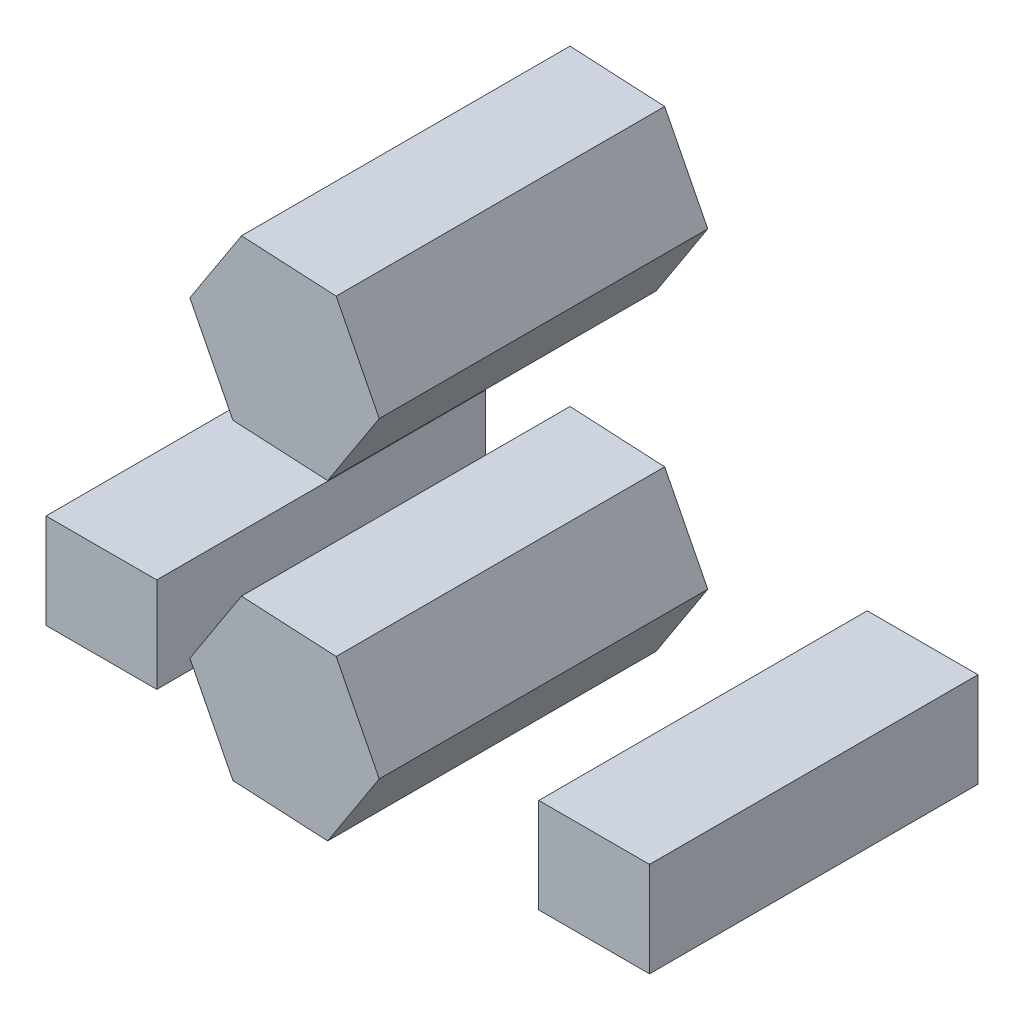
ISO-10303-21;
HEADER;
FILE_DESCRIPTION(('STEP AP214'),'2;1');
FILE_NAME('part.step','',(''),(''),'','','');
FILE_SCHEMA(('AUTOMOTIVE_DESIGN { 1 0 10303 214 1 1 1 1 }'));
ENDSEC;
DATA;
#1=APPLICATION_CONTEXT('core data for automotive mechanical design processes');
#2=APPLICATION_PROTOCOL_DEFINITION('international standard','automotive_design',2000,#1);
#3=PRODUCT_CONTEXT('',#1,'mechanical');
#4=PRODUCT('Part','Part','',(#3));
#5=PRODUCT_RELATED_PRODUCT_CATEGORY('part','',(#4));
#6=PRODUCT_DEFINITION_FORMATION('','',#4);
#7=PRODUCT_DEFINITION_CONTEXT('part definition',#1,'design');
#8=PRODUCT_DEFINITION('design','',#6,#7);
#9=PRODUCT_DEFINITION_SHAPE('','',#8);
#10=(LENGTH_UNIT() NAMED_UNIT(*) SI_UNIT(.MILLI.,.METRE.));
#11=(NAMED_UNIT(*) PLANE_ANGLE_UNIT() SI_UNIT($,.RADIAN.));
#12=(NAMED_UNIT(*) SI_UNIT($,.STERADIAN.) SOLID_ANGLE_UNIT());
#13=UNCERTAINTY_MEASURE_WITH_UNIT(LENGTH_MEASURE(1.E-05),#10,'distance_accuracy_value','');
#14=(GEOMETRIC_REPRESENTATION_CONTEXT(3) GLOBAL_UNCERTAINTY_ASSIGNED_CONTEXT((#13)) GLOBAL_UNIT_ASSIGNED_CONTEXT((#10,
#11,#12)) REPRESENTATION_CONTEXT('',''));
#15=CARTESIAN_POINT('',(0.,0.,0.));
#16=DIRECTION('',(0.,0.,1.));
#17=DIRECTION('',(1.,0.,0.));
#18=AXIS2_PLACEMENT_3D('',#15,#16,#17);
#19=CARTESIAN_POINT('',(26.2277971585116,138.566197986681,200.));
#20=DIRECTION('',(-0.838846748945208,0.544367643954025,0.));
#21=DIRECTION('',(-0.544367643954025,-0.838846748945208,0.));
#22=AXIS2_PLACEMENT_3D('',#19,#20,#21);
#23=PLANE('',#22);
#24=DIRECTION('',(0.544367643954025,0.838846748945208,0.));
#25=VECTOR('',#24,1.);
#26=CARTESIAN_POINT('',(26.2277971585116,138.566197986681,0.));
#27=LINE('',#26,#25);
#28=CARTESIAN_POINT('',(26.2277971585116,138.566197986681,0.));
#29=VERTEX_POINT('',#28);
#30=CARTESIAN_POINT('',(57.6568777360095,186.997037617917,0.));
#31=VERTEX_POINT('',#30);
#32=EDGE_CURVE('E132',#29,#31,#27,.T.);
#33=ORIENTED_EDGE('',*,*,#32,.T.);
#34=DIRECTION('',(0.,0.,-1.));
#35=VECTOR('',#34,1.);
#36=CARTESIAN_POINT('',(57.6568777360095,186.997037617917,200.));
#37=LINE('',#36,#35);
#38=CARTESIAN_POINT('',(57.6568777360095,186.997037617917,200.));
#39=VERTEX_POINT('',#38);
#40=EDGE_CURVE('E12',#39,#31,#37,.T.);
#41=ORIENTED_EDGE('',*,*,#40,.F.);
#42=DIRECTION('',(0.544367643954025,0.838846748945208,0.));
#43=VECTOR('',#42,1.);
#44=CARTESIAN_POINT('',(26.2277971585116,138.566197986681,200.));
#45=LINE('',#44,#43);
#46=CARTESIAN_POINT('',(26.2277971585116,138.566197986681,200.));
#47=VERTEX_POINT('',#46);
#48=EDGE_CURVE('E142',#47,#39,#45,.T.);
#49=ORIENTED_EDGE('',*,*,#48,.F.);
#50=DIRECTION('',(0.,0.,-1.));
#51=VECTOR('',#50,1.);
#52=CARTESIAN_POINT('',(26.2277971585116,138.566197986681,200.));
#53=LINE('',#52,#51);
#54=EDGE_CURVE('E128',#47,#29,#53,.T.);
#55=ORIENTED_EDGE('',*,*,#54,.T.);
#56=EDGE_LOOP('',(#33,#41,#49,#55));
#57=FACE_BOUND('',#56,.T.);
#58=ADVANCED_FACE('F48',(#57),#23,.F.);
#59=CARTESIAN_POINT('',(57.6568777360095,186.997037617917,200.));
#60=DIRECTION('',(-0.890859583135072,-0.454278772491525,0.));
#61=DIRECTION('',(0.454278772491525,-0.890859583135072,0.));
#62=AXIS2_PLACEMENT_3D('',#59,#60,#61);
#63=PLANE('',#62);
#64=DIRECTION('',(-0.454278772491525,0.890859583135072,0.));
#65=VECTOR('',#64,1.);
#66=CARTESIAN_POINT('',(57.6568777360095,186.997037617917,0.));
#67=LINE('',#66,#65);
#68=CARTESIAN_POINT('',(31.429080577498,238.430839631236,0.));
#69=VERTEX_POINT('',#68);
#70=EDGE_CURVE('E135',#31,#69,#67,.T.);
#71=ORIENTED_EDGE('',*,*,#70,.T.);
#72=DIRECTION('',(0.,0.,-1.));
#73=VECTOR('',#72,1.);
#74=CARTESIAN_POINT('',(31.429080577498,238.430839631236,200.));
#75=LINE('',#74,#73);
#76=CARTESIAN_POINT('',(31.429080577498,238.430839631236,200.));
#77=VERTEX_POINT('',#76);
#78=EDGE_CURVE('E56',#77,#69,#75,.T.);
#79=ORIENTED_EDGE('',*,*,#78,.F.);
#80=DIRECTION('',(-0.454278772491525,0.890859583135072,0.));
#81=VECTOR('',#80,1.);
#82=CARTESIAN_POINT('',(57.6568777360095,186.997037617917,200.));
#83=LINE('',#82,#81);
#84=EDGE_CURVE('E101',#39,#77,#83,.T.);
#85=ORIENTED_EDGE('',*,*,#84,.F.);
#86=ORIENTED_EDGE('',*,*,#40,.T.);
#87=EDGE_LOOP('',(#71,#79,#85,#86));
#88=FACE_BOUND('',#87,.T.);
#89=ADVANCED_FACE('F166',(#88),#63,.F.);
#90=CARTESIAN_POINT('',(31.429080577498,238.430839631236,200.));
#91=DIRECTION('',(-0.0520128341898639,-0.998646416445549,0.));
#92=DIRECTION('',(0.998646416445549,-0.0520128341898639,0.));
#93=AXIS2_PLACEMENT_3D('',#90,#91,#92);
#94=PLANE('',#93);
#95=DIRECTION('',(-0.998646416445549,0.0520128341898639,0.));
#96=VECTOR('',#95,1.);
#97=CARTESIAN_POINT('',(31.429080577498,238.430839631236,0.));
#98=LINE('',#97,#96);
#99=CARTESIAN_POINT('',(-26.2277971585116,241.433802013319,0.));
#100=VERTEX_POINT('',#99);
#101=EDGE_CURVE('E137',#69,#100,#98,.T.);
#102=ORIENTED_EDGE('',*,*,#101,.T.);
#103=DIRECTION('',(0.,0.,-1.));
#104=VECTOR('',#103,1.);
#105=CARTESIAN_POINT('',(-26.2277971585116,241.433802013319,200.));
#106=LINE('',#105,#104);
#107=CARTESIAN_POINT('',(-26.2277971585116,241.433802013319,200.));
#108=VERTEX_POINT('',#107);
#109=EDGE_CURVE('E123',#108,#100,#106,.T.);
#110=ORIENTED_EDGE('',*,*,#109,.F.);
#111=DIRECTION('',(-0.998646416445549,0.0520128341898639,0.));
#112=VECTOR('',#111,1.);
#113=CARTESIAN_POINT('',(31.429080577498,238.430839631236,200.));
#114=LINE('',#113,#112);
#115=EDGE_CURVE('E114',#77,#108,#114,.T.);
#116=ORIENTED_EDGE('',*,*,#115,.F.);
#117=ORIENTED_EDGE('',*,*,#78,.T.);
#118=EDGE_LOOP('',(#102,#110,#116,#117));
#119=FACE_BOUND('',#118,.T.);
#120=ADVANCED_FACE('F148',(#119),#94,.F.);
#121=CARTESIAN_POINT('',(-26.2277971585116,241.433802013319,200.));
#122=DIRECTION('',(0.838846748945208,-0.544367643954025,0.));
#123=DIRECTION('',(0.544367643954025,0.838846748945208,0.));
#124=AXIS2_PLACEMENT_3D('',#121,#122,#123);
#125=PLANE('',#124);
#126=DIRECTION('',(-0.544367643954025,-0.838846748945208,0.));
#127=VECTOR('',#126,1.);
#128=CARTESIAN_POINT('',(-26.2277971585116,241.433802013319,0.));
#129=LINE('',#128,#127);
#130=CARTESIAN_POINT('',(-57.6568777360095,193.002962382083,0.));
#131=VERTEX_POINT('',#130);
#132=EDGE_CURVE('E122',#100,#131,#129,.T.);
#133=ORIENTED_EDGE('',*,*,#132,.T.);
#134=DIRECTION('',(0.,0.,-1.));
#135=VECTOR('',#134,1.);
#136=CARTESIAN_POINT('',(-57.6568777360095,193.002962382083,200.));
#137=LINE('',#136,#135);
#138=CARTESIAN_POINT('',(-57.6568777360095,193.002962382083,200.));
#139=VERTEX_POINT('',#138);
#140=EDGE_CURVE('E119',#139,#131,#137,.T.);
#141=ORIENTED_EDGE('',*,*,#140,.F.);
#142=DIRECTION('',(-0.544367643954025,-0.838846748945208,0.));
#143=VECTOR('',#142,1.);
#144=CARTESIAN_POINT('',(-26.2277971585116,241.433802013319,200.));
#145=LINE('',#144,#143);
#146=EDGE_CURVE('E108',#108,#139,#145,.T.);
#147=ORIENTED_EDGE('',*,*,#146,.F.);
#148=ORIENTED_EDGE('',*,*,#109,.T.);
#149=EDGE_LOOP('',(#133,#141,#147,#148));
#150=FACE_BOUND('',#149,.T.);
#151=ADVANCED_FACE('F120',(#150),#125,.F.);
#152=CARTESIAN_POINT('',(-57.6568777360095,193.002962382083,200.));
#153=DIRECTION('',(0.890859583135072,0.454278772491525,0.));
#154=DIRECTION('',(-0.454278772491525,0.890859583135072,0.));
#155=AXIS2_PLACEMENT_3D('',#152,#153,#154);
#156=PLANE('',#155);
#157=DIRECTION('',(0.454278772491525,-0.890859583135072,0.));
#158=VECTOR('',#157,1.);
#159=CARTESIAN_POINT('',(-57.6568777360095,193.002962382083,0.));
#160=LINE('',#159,#158);
#161=CARTESIAN_POINT('',(-31.429080577498,141.569160368764,0.));
#162=VERTEX_POINT('',#161);
#163=EDGE_CURVE('E87',#131,#162,#160,.T.);
#164=ORIENTED_EDGE('',*,*,#163,.T.);
#165=DIRECTION('',(0.,0.,-1.));
#166=VECTOR('',#165,1.);
#167=CARTESIAN_POINT('',(-31.429080577498,141.569160368764,200.));
#168=LINE('',#167,#166);
#169=CARTESIAN_POINT('',(-31.429080577498,141.569160368764,200.));
#170=VERTEX_POINT('',#169);
#171=EDGE_CURVE('E124',#170,#162,#168,.T.);
#172=ORIENTED_EDGE('',*,*,#171,.F.);
#173=DIRECTION('',(0.454278772491525,-0.890859583135072,0.));
#174=VECTOR('',#173,1.);
#175=CARTESIAN_POINT('',(-57.6568777360095,193.002962382083,200.));
#176=LINE('',#175,#174);
#177=EDGE_CURVE('E112',#139,#170,#176,.T.);
#178=ORIENTED_EDGE('',*,*,#177,.F.);
#179=ORIENTED_EDGE('',*,*,#140,.T.);
#180=EDGE_LOOP('',(#164,#172,#178,#179));
#181=FACE_BOUND('',#180,.T.);
#182=ADVANCED_FACE('F126',(#181),#156,.F.);
#183=CARTESIAN_POINT('',(-31.429080577498,141.569160368764,200.));
#184=DIRECTION('',(0.052012834189864,0.998646416445549,0.));
#185=DIRECTION('',(-0.998646416445549,0.052012834189864,0.));
#186=AXIS2_PLACEMENT_3D('',#183,#184,#185);
#187=PLANE('',#186);
#188=DIRECTION('',(0.998646416445549,-0.052012834189864,0.));
#189=VECTOR('',#188,1.);
#190=CARTESIAN_POINT('',(-31.429080577498,141.569160368764,0.));
#191=LINE('',#190,#189);
#192=EDGE_CURVE('E93',#162,#29,#191,.T.);
#193=ORIENTED_EDGE('',*,*,#192,.T.);
#194=ORIENTED_EDGE('',*,*,#54,.F.);
#195=DIRECTION('',(0.998646416445549,-0.052012834189864,0.));
#196=VECTOR('',#195,1.);
#197=CARTESIAN_POINT('',(-31.429080577498,141.569160368764,200.));
#198=LINE('',#197,#196);
#199=EDGE_CURVE('E64',#170,#47,#198,.T.);
#200=ORIENTED_EDGE('',*,*,#199,.F.);
#201=ORIENTED_EDGE('',*,*,#171,.T.);
#202=EDGE_LOOP('',(#193,#194,#200,#201));
#203=FACE_BOUND('',#202,.T.);
#204=ADVANCED_FACE('F155',(#203),#187,.F.);
#205=CARTESIAN_POINT('',(0.,190.,200.));
#206=DIRECTION('',(0.,0.,1.));
#207=DIRECTION('',(1.,0.,0.));
#208=AXIS2_PLACEMENT_3D('',#205,#206,#207);
#209=PLANE('',#208);
#210=ORIENTED_EDGE('',*,*,#48,.T.);
#211=ORIENTED_EDGE('',*,*,#84,.T.);
#212=ORIENTED_EDGE('',*,*,#115,.T.);
#213=ORIENTED_EDGE('',*,*,#146,.T.);
#214=ORIENTED_EDGE('',*,*,#177,.T.);
#215=ORIENTED_EDGE('',*,*,#199,.T.);
#216=EDGE_LOOP('',(#210,#211,#212,#213,#214,#215));
#217=FACE_BOUND('',#216,.T.);
#218=ADVANCED_FACE('F110',(#217),#209,.T.);
#219=CARTESIAN_POINT('',(0.,190.,0.));
#220=DIRECTION('',(0.,0.,1.));
#221=DIRECTION('',(1.,0.,0.));
#222=AXIS2_PLACEMENT_3D('',#219,#220,#221);
#223=PLANE('',#222);
#224=ORIENTED_EDGE('',*,*,#32,.F.);
#225=ORIENTED_EDGE('',*,*,#192,.F.);
#226=ORIENTED_EDGE('',*,*,#163,.F.);
#227=ORIENTED_EDGE('',*,*,#132,.F.);
#228=ORIENTED_EDGE('',*,*,#101,.F.);
#229=ORIENTED_EDGE('',*,*,#70,.F.);
#230=EDGE_LOOP('',(#224,#225,#226,#227,#228,#229));
#231=FACE_BOUND('',#230,.T.);
#232=ADVANCED_FACE('F151',(#231),#223,.F.);
#233=CLOSED_SHELL('',(#58,#89,#120,#151,#182,#204,#218,#232));
#234=MANIFOLD_SOLID_BREP('B2',#233);
#235=CARTESIAN_POINT('',(222.187949043573,34.1901436020656,200.));
#236=DIRECTION('',(-1.,0.,0.));
#237=DIRECTION('',(0.,-1.,0.));
#238=AXIS2_PLACEMENT_3D('',#235,#236,#237);
#239=PLANE('',#238);
#240=DIRECTION('',(0.,1.,0.));
#241=VECTOR('',#240,1.);
#242=CARTESIAN_POINT('',(222.187949043573,34.1901436020656,0.));
#243=LINE('',#242,#241);
#244=CARTESIAN_POINT('',(222.187949043573,-23.5498563979344,0.));
#245=VERTEX_POINT('',#244);
#246=CARTESIAN_POINT('',(222.187949043573,34.1901436020656,0.));
#247=VERTEX_POINT('',#246);
#248=EDGE_CURVE('E313',#245,#247,#243,.T.);
#249=ORIENTED_EDGE('',*,*,#248,.T.);
#250=DIRECTION('',(0.,0.,-1.));
#251=VECTOR('',#250,1.);
#252=CARTESIAN_POINT('',(222.187949043573,34.1901436020656,200.));
#253=LINE('',#252,#251);
#254=CARTESIAN_POINT('',(222.187949043573,34.1901436020656,200.));
#255=VERTEX_POINT('',#254);
#256=EDGE_CURVE('E46',#255,#247,#253,.T.);
#257=ORIENTED_EDGE('',*,*,#256,.F.);
#258=DIRECTION('',(0.,1.,0.));
#259=VECTOR('',#258,1.);
#260=CARTESIAN_POINT('',(222.187949043573,34.1901436020656,200.));
#261=LINE('',#260,#259);
#262=CARTESIAN_POINT('',(222.187949043573,-23.5498563979344,200.));
#263=VERTEX_POINT('',#262);
#264=EDGE_CURVE('E301',#263,#255,#261,.T.);
#265=ORIENTED_EDGE('',*,*,#264,.F.);
#266=DIRECTION('',(0.,0.,-1.));
#267=VECTOR('',#266,1.);
#268=CARTESIAN_POINT('',(222.187949043573,-23.5498563979344,200.));
#269=LINE('',#268,#267);
#270=EDGE_CURVE('E309',#263,#245,#269,.T.);
#271=ORIENTED_EDGE('',*,*,#270,.T.);
#272=EDGE_LOOP('',(#249,#257,#265,#271));
#273=FACE_BOUND('',#272,.T.);
#274=ADVANCED_FACE('F250',(#273),#239,.F.);
#275=CARTESIAN_POINT('',(154.75083821467,34.1901436020656,200.));
#276=DIRECTION('',(0.,-1.,0.));
#277=DIRECTION('',(0.,0.,-1.));
#278=AXIS2_PLACEMENT_3D('',#275,#276,#277);
#279=PLANE('',#278);
#280=DIRECTION('',(-1.,0.,0.));
#281=VECTOR('',#280,1.);
#282=CARTESIAN_POINT('',(154.75083821467,34.1901436020656,0.));
#283=LINE('',#282,#281);
#284=CARTESIAN_POINT('',(154.75083821467,34.1901436020656,0.));
#285=VERTEX_POINT('',#284);
#286=EDGE_CURVE('E305',#247,#285,#283,.T.);
#287=ORIENTED_EDGE('',*,*,#286,.T.);
#288=DIRECTION('',(0.,0.,-1.));
#289=VECTOR('',#288,1.);
#290=CARTESIAN_POINT('',(154.75083821467,34.1901436020656,200.));
#291=LINE('',#290,#289);
#292=CARTESIAN_POINT('',(154.75083821467,34.1901436020656,200.));
#293=VERTEX_POINT('',#292);
#294=EDGE_CURVE('E258',#293,#285,#291,.T.);
#295=ORIENTED_EDGE('',*,*,#294,.F.);
#296=DIRECTION('',(-1.,0.,0.));
#297=VECTOR('',#296,1.);
#298=CARTESIAN_POINT('',(154.75083821467,34.1901436020656,200.));
#299=LINE('',#298,#297);
#300=EDGE_CURVE('E296',#255,#293,#299,.T.);
#301=ORIENTED_EDGE('',*,*,#300,.F.);
#302=ORIENTED_EDGE('',*,*,#256,.T.);
#303=EDGE_LOOP('',(#287,#295,#301,#302));
#304=FACE_BOUND('',#303,.T.);
#305=ADVANCED_FACE('F304',(#304),#279,.F.);
#306=CARTESIAN_POINT('',(154.75083821467,34.1901436020656,200.));
#307=DIRECTION('',(1.,0.,0.));
#308=DIRECTION('',(0.,0.,-1.));
#309=AXIS2_PLACEMENT_3D('',#306,#307,#308);
#310=PLANE('',#309);
#311=DIRECTION('',(0.,-1.,0.));
#312=VECTOR('',#311,1.);
#313=CARTESIAN_POINT('',(154.75083821467,34.1901436020656,0.));
#314=LINE('',#313,#312);
#315=CARTESIAN_POINT('',(154.75083821467,-23.5498563979344,0.));
#316=VERTEX_POINT('',#315);
#317=EDGE_CURVE('E283',#285,#316,#314,.T.);
#318=ORIENTED_EDGE('',*,*,#317,.T.);
#319=DIRECTION('',(0.,0.,-1.));
#320=VECTOR('',#319,1.);
#321=CARTESIAN_POINT('',(154.75083821467,-23.5498563979344,200.));
#322=LINE('',#321,#320);
#323=CARTESIAN_POINT('',(154.75083821467,-23.5498563979344,200.));
#324=VERTEX_POINT('',#323);
#325=EDGE_CURVE('E306',#324,#316,#322,.T.);
#326=ORIENTED_EDGE('',*,*,#325,.F.);
#327=DIRECTION('',(0.,-1.,0.));
#328=VECTOR('',#327,1.);
#329=CARTESIAN_POINT('',(154.75083821467,34.1901436020656,200.));
#330=LINE('',#329,#328);
#331=EDGE_CURVE('E299',#293,#324,#330,.T.);
#332=ORIENTED_EDGE('',*,*,#331,.F.);
#333=ORIENTED_EDGE('',*,*,#294,.T.);
#334=EDGE_LOOP('',(#318,#326,#332,#333));
#335=FACE_BOUND('',#334,.T.);
#336=ADVANCED_FACE('F307',(#335),#310,.F.);
#337=CARTESIAN_POINT('',(154.75083821467,-23.5498563979344,200.));
#338=DIRECTION('',(0.,1.,0.));
#339=DIRECTION('',(0.,0.,1.));
#340=AXIS2_PLACEMENT_3D('',#337,#338,#339);
#341=PLANE('',#340);
#342=DIRECTION('',(1.,0.,0.));
#343=VECTOR('',#342,1.);
#344=CARTESIAN_POINT('',(154.75083821467,-23.5498563979344,0.));
#345=LINE('',#344,#343);
#346=EDGE_CURVE('E289',#316,#245,#345,.T.);
#347=ORIENTED_EDGE('',*,*,#346,.T.);
#348=ORIENTED_EDGE('',*,*,#270,.F.);
#349=DIRECTION('',(1.,0.,0.));
#350=VECTOR('',#349,1.);
#351=CARTESIAN_POINT('',(154.75083821467,-23.5498563979344,200.));
#352=LINE('',#351,#350);
#353=EDGE_CURVE('E266',#324,#263,#352,.T.);
#354=ORIENTED_EDGE('',*,*,#353,.F.);
#355=ORIENTED_EDGE('',*,*,#325,.T.);
#356=EDGE_LOOP('',(#347,#348,#354,#355));
#357=FACE_BOUND('',#356,.T.);
#358=ADVANCED_FACE('F320',(#357),#341,.F.);
#359=CARTESIAN_POINT('',(300.,0.,200.));
#360=DIRECTION('',(0.,0.,1.));
#361=DIRECTION('',(1.,0.,0.));
#362=AXIS2_PLACEMENT_3D('',#359,#360,#361);
#363=PLANE('',#362);
#364=ORIENTED_EDGE('',*,*,#264,.T.);
#365=ORIENTED_EDGE('',*,*,#300,.T.);
#366=ORIENTED_EDGE('',*,*,#331,.T.);
#367=ORIENTED_EDGE('',*,*,#353,.T.);
#368=EDGE_LOOP('',(#364,#365,#366,#367));
#369=FACE_BOUND('',#368,.T.);
#370=ADVANCED_FACE('F297',(#369),#363,.T.);
#371=CARTESIAN_POINT('',(300.,0.,0.));
#372=DIRECTION('',(0.,0.,1.));
#373=DIRECTION('',(1.,0.,0.));
#374=AXIS2_PLACEMENT_3D('',#371,#372,#373);
#375=PLANE('',#374);
#376=ORIENTED_EDGE('',*,*,#248,.F.);
#377=ORIENTED_EDGE('',*,*,#346,.F.);
#378=ORIENTED_EDGE('',*,*,#317,.F.);
#379=ORIENTED_EDGE('',*,*,#286,.F.);
#380=EDGE_LOOP('',(#376,#377,#378,#379));
#381=FACE_BOUND('',#380,.T.);
#382=ADVANCED_FACE('F323',(#381),#375,.F.);
#383=CLOSED_SHELL('',(#274,#305,#336,#358,#370,#382));
#384=MANIFOLD_SOLID_BREP('B6',#383);
#385=CARTESIAN_POINT('',(-77.8120509564268,34.1901436020656,200.));
#386=DIRECTION('',(-1.,0.,0.));
#387=DIRECTION('',(0.,-1.,0.));
#388=AXIS2_PLACEMENT_3D('',#385,#386,#387);
#389=PLANE('',#388);
#390=DIRECTION('',(0.,1.,0.));
#391=VECTOR('',#390,1.);
#392=CARTESIAN_POINT('',(-77.8120509564268,34.1901436020656,0.));
#393=LINE('',#392,#391);
#394=CARTESIAN_POINT('',(-77.8120509564268,-23.5498563979344,0.));
#395=VERTEX_POINT('',#394);
#396=CARTESIAN_POINT('',(-77.8120509564268,34.1901436020656,0.));
#397=VERTEX_POINT('',#396);
#398=EDGE_CURVE('E458',#395,#397,#393,.T.);
#399=ORIENTED_EDGE('',*,*,#398,.T.);
#400=DIRECTION('',(0.,0.,-1.));
#401=VECTOR('',#400,1.);
#402=CARTESIAN_POINT('',(-77.8120509564268,34.1901436020656,200.));
#403=LINE('',#402,#401);
#404=CARTESIAN_POINT('',(-77.8120509564268,34.1901436020656,200.));
#405=VERTEX_POINT('',#404);
#406=EDGE_CURVE('E248',#405,#397,#403,.T.);
#407=ORIENTED_EDGE('',*,*,#406,.F.);
#408=DIRECTION('',(0.,1.,0.));
#409=VECTOR('',#408,1.);
#410=CARTESIAN_POINT('',(-77.8120509564268,34.1901436020656,200.));
#411=LINE('',#410,#409);
#412=CARTESIAN_POINT('',(-77.8120509564268,-23.5498563979344,200.));
#413=VERTEX_POINT('',#412);
#414=EDGE_CURVE('E446',#413,#405,#411,.T.);
#415=ORIENTED_EDGE('',*,*,#414,.F.);
#416=DIRECTION('',(0.,0.,-1.));
#417=VECTOR('',#416,1.);
#418=CARTESIAN_POINT('',(-77.8120509564268,-23.5498563979344,200.));
#419=LINE('',#418,#417);
#420=EDGE_CURVE('E454',#413,#395,#419,.T.);
#421=ORIENTED_EDGE('',*,*,#420,.T.);
#422=EDGE_LOOP('',(#399,#407,#415,#421));
#423=FACE_BOUND('',#422,.T.);
#424=ADVANCED_FACE('F395',(#423),#389,.F.);
#425=CARTESIAN_POINT('',(-145.24916178533,34.1901436020656,200.));
#426=DIRECTION('',(0.,-1.,0.));
#427=DIRECTION('',(0.,0.,-1.));
#428=AXIS2_PLACEMENT_3D('',#425,#426,#427);
#429=PLANE('',#428);
#430=DIRECTION('',(-1.,0.,0.));
#431=VECTOR('',#430,1.);
#432=CARTESIAN_POINT('',(-145.24916178533,34.1901436020656,0.));
#433=LINE('',#432,#431);
#434=CARTESIAN_POINT('',(-145.24916178533,34.1901436020656,0.));
#435=VERTEX_POINT('',#434);
#436=EDGE_CURVE('E450',#397,#435,#433,.T.);
#437=ORIENTED_EDGE('',*,*,#436,.T.);
#438=DIRECTION('',(0.,0.,-1.));
#439=VECTOR('',#438,1.);
#440=CARTESIAN_POINT('',(-145.24916178533,34.1901436020656,200.));
#441=LINE('',#440,#439);
#442=CARTESIAN_POINT('',(-145.24916178533,34.1901436020656,200.));
#443=VERTEX_POINT('',#442);
#444=EDGE_CURVE('E403',#443,#435,#441,.T.);
#445=ORIENTED_EDGE('',*,*,#444,.F.);
#446=DIRECTION('',(-1.,0.,0.));
#447=VECTOR('',#446,1.);
#448=CARTESIAN_POINT('',(-145.24916178533,34.1901436020656,200.));
#449=LINE('',#448,#447);
#450=EDGE_CURVE('E441',#405,#443,#449,.T.);
#451=ORIENTED_EDGE('',*,*,#450,.F.);
#452=ORIENTED_EDGE('',*,*,#406,.T.);
#453=EDGE_LOOP('',(#437,#445,#451,#452));
#454=FACE_BOUND('',#453,.T.);
#455=ADVANCED_FACE('F449',(#454),#429,.F.);
#456=CARTESIAN_POINT('',(-145.24916178533,34.1901436020656,200.));
#457=DIRECTION('',(1.,0.,0.));
#458=DIRECTION('',(0.,0.,-1.));
#459=AXIS2_PLACEMENT_3D('',#456,#457,#458);
#460=PLANE('',#459);
#461=DIRECTION('',(0.,-1.,0.));
#462=VECTOR('',#461,1.);
#463=CARTESIAN_POINT('',(-145.24916178533,34.1901436020656,0.));
#464=LINE('',#463,#462);
#465=CARTESIAN_POINT('',(-145.24916178533,-23.5498563979344,0.));
#466=VERTEX_POINT('',#465);
#467=EDGE_CURVE('E428',#435,#466,#464,.T.);
#468=ORIENTED_EDGE('',*,*,#467,.T.);
#469=DIRECTION('',(0.,0.,-1.));
#470=VECTOR('',#469,1.);
#471=CARTESIAN_POINT('',(-145.24916178533,-23.5498563979344,200.));
#472=LINE('',#471,#470);
#473=CARTESIAN_POINT('',(-145.24916178533,-23.5498563979344,200.));
#474=VERTEX_POINT('',#473);
#475=EDGE_CURVE('E451',#474,#466,#472,.T.);
#476=ORIENTED_EDGE('',*,*,#475,.F.);
#477=DIRECTION('',(0.,-1.,0.));
#478=VECTOR('',#477,1.);
#479=CARTESIAN_POINT('',(-145.24916178533,34.1901436020656,200.));
#480=LINE('',#479,#478);
#481=EDGE_CURVE('E444',#443,#474,#480,.T.);
#482=ORIENTED_EDGE('',*,*,#481,.F.);
#483=ORIENTED_EDGE('',*,*,#444,.T.);
#484=EDGE_LOOP('',(#468,#476,#482,#483));
#485=FACE_BOUND('',#484,.T.);
#486=ADVANCED_FACE('F452',(#485),#460,.F.);
#487=CARTESIAN_POINT('',(-145.24916178533,-23.5498563979344,200.));
#488=DIRECTION('',(0.,1.,0.));
#489=DIRECTION('',(0.,0.,1.));
#490=AXIS2_PLACEMENT_3D('',#487,#488,#489);
#491=PLANE('',#490);
#492=DIRECTION('',(1.,0.,0.));
#493=VECTOR('',#492,1.);
#494=CARTESIAN_POINT('',(-145.24916178533,-23.5498563979344,0.));
#495=LINE('',#494,#493);
#496=EDGE_CURVE('E434',#466,#395,#495,.T.);
#497=ORIENTED_EDGE('',*,*,#496,.T.);
#498=ORIENTED_EDGE('',*,*,#420,.F.);
#499=DIRECTION('',(1.,0.,0.));
#500=VECTOR('',#499,1.);
#501=CARTESIAN_POINT('',(-145.24916178533,-23.5498563979344,200.));
#502=LINE('',#501,#500);
#503=EDGE_CURVE('E411',#474,#413,#502,.T.);
#504=ORIENTED_EDGE('',*,*,#503,.F.);
#505=ORIENTED_EDGE('',*,*,#475,.T.);
#506=EDGE_LOOP('',(#497,#498,#504,#505));
#507=FACE_BOUND('',#506,.T.);
#508=ADVANCED_FACE('F465',(#507),#491,.F.);
#509=CARTESIAN_POINT('',(0.,0.,200.));
#510=DIRECTION('',(0.,0.,1.));
#511=DIRECTION('',(1.,0.,0.));
#512=AXIS2_PLACEMENT_3D('',#509,#510,#511);
#513=PLANE('',#512);
#514=ORIENTED_EDGE('',*,*,#414,.T.);
#515=ORIENTED_EDGE('',*,*,#450,.T.);
#516=ORIENTED_EDGE('',*,*,#481,.T.);
#517=ORIENTED_EDGE('',*,*,#503,.T.);
#518=EDGE_LOOP('',(#514,#515,#516,#517));
#519=FACE_BOUND('',#518,.T.);
#520=ADVANCED_FACE('F442',(#519),#513,.T.);
#521=CARTESIAN_POINT('',(0.,0.,0.));
#522=DIRECTION('',(0.,0.,1.));
#523=DIRECTION('',(1.,0.,0.));
#524=AXIS2_PLACEMENT_3D('',#521,#522,#523);
#525=PLANE('',#524);
#526=ORIENTED_EDGE('',*,*,#398,.F.);
#527=ORIENTED_EDGE('',*,*,#496,.F.);
#528=ORIENTED_EDGE('',*,*,#467,.F.);
#529=ORIENTED_EDGE('',*,*,#436,.F.);
#530=EDGE_LOOP('',(#526,#527,#528,#529));
#531=FACE_BOUND('',#530,.T.);
#532=ADVANCED_FACE('F468',(#531),#525,.F.);
#533=CLOSED_SHELL('',(#424,#455,#486,#508,#520,#532));
#534=MANIFOLD_SOLID_BREP('B40',#533);
#535=CARTESIAN_POINT('',(26.2277971585116,-51.4338020133194,200.));
#536=DIRECTION('',(-0.838846748945208,0.544367643954025,0.));
#537=DIRECTION('',(-0.544367643954025,-0.838846748945208,0.));
#538=AXIS2_PLACEMENT_3D('',#535,#536,#537);
#539=PLANE('',#538);
#540=DIRECTION('',(0.544367643954025,0.838846748945208,0.));
#541=VECTOR('',#540,1.);
#542=CARTESIAN_POINT('',(26.2277971585116,-51.4338020133194,0.));
#543=LINE('',#542,#541);
#544=CARTESIAN_POINT('',(26.2277971585116,-51.4338020133194,0.));
#545=VERTEX_POINT('',#544);
#546=CARTESIAN_POINT('',(57.6568777360095,-3.00296238208335,0.));
#547=VERTEX_POINT('',#546);
#548=EDGE_CURVE('E615',#545,#547,#543,.T.);
#549=ORIENTED_EDGE('',*,*,#548,.T.);
#550=DIRECTION('',(0.,0.,-1.));
#551=VECTOR('',#550,1.);
#552=CARTESIAN_POINT('',(57.6568777360095,-3.00296238208335,200.));
#553=LINE('',#552,#551);
#554=CARTESIAN_POINT('',(57.6568777360095,-3.00296238208335,200.));
#555=VERTEX_POINT('',#554);
#556=EDGE_CURVE('E393',#555,#547,#553,.T.);
#557=ORIENTED_EDGE('',*,*,#556,.F.);
#558=DIRECTION('',(0.544367643954025,0.838846748945208,0.));
#559=VECTOR('',#558,1.);
#560=CARTESIAN_POINT('',(26.2277971585116,-51.4338020133194,200.));
#561=LINE('',#560,#559);
#562=CARTESIAN_POINT('',(26.2277971585116,-51.4338020133194,200.));
#563=VERTEX_POINT('',#562);
#564=EDGE_CURVE('E625',#563,#555,#561,.T.);
#565=ORIENTED_EDGE('',*,*,#564,.F.);
#566=DIRECTION('',(0.,0.,-1.));
#567=VECTOR('',#566,1.);
#568=CARTESIAN_POINT('',(26.2277971585116,-51.4338020133194,200.));
#569=LINE('',#568,#567);
#570=EDGE_CURVE('E611',#563,#545,#569,.T.);
#571=ORIENTED_EDGE('',*,*,#570,.T.);
#572=EDGE_LOOP('',(#549,#557,#565,#571));
#573=FACE_BOUND('',#572,.T.);
#574=ADVANCED_FACE('F531',(#573),#539,.F.);
#575=CARTESIAN_POINT('',(57.6568777360095,-3.00296238208335,200.));
#576=DIRECTION('',(-0.890859583135072,-0.454278772491525,0.));
#577=DIRECTION('',(0.454278772491525,-0.890859583135072,0.));
#578=AXIS2_PLACEMENT_3D('',#575,#576,#577);
#579=PLANE('',#578);
#580=DIRECTION('',(-0.454278772491525,0.890859583135072,0.));
#581=VECTOR('',#580,1.);
#582=CARTESIAN_POINT('',(57.6568777360095,-3.00296238208335,0.));
#583=LINE('',#582,#581);
#584=CARTESIAN_POINT('',(31.429080577498,48.430839631236,0.));
#585=VERTEX_POINT('',#584);
#586=EDGE_CURVE('E618',#547,#585,#583,.T.);
#587=ORIENTED_EDGE('',*,*,#586,.T.);
#588=DIRECTION('',(0.,0.,-1.));
#589=VECTOR('',#588,1.);
#590=CARTESIAN_POINT('',(31.429080577498,48.430839631236,200.));
#591=LINE('',#590,#589);
#592=CARTESIAN_POINT('',(31.429080577498,48.430839631236,200.));
#593=VERTEX_POINT('',#592);
#594=EDGE_CURVE('E539',#593,#585,#591,.T.);
#595=ORIENTED_EDGE('',*,*,#594,.F.);
#596=DIRECTION('',(-0.454278772491525,0.890859583135072,0.));
#597=VECTOR('',#596,1.);
#598=CARTESIAN_POINT('',(57.6568777360095,-3.00296238208335,200.));
#599=LINE('',#598,#597);
#600=EDGE_CURVE('E584',#555,#593,#599,.T.);
#601=ORIENTED_EDGE('',*,*,#600,.F.);
#602=ORIENTED_EDGE('',*,*,#556,.T.);
#603=EDGE_LOOP('',(#587,#595,#601,#602));
#604=FACE_BOUND('',#603,.T.);
#605=ADVANCED_FACE('F649',(#604),#579,.F.);
#606=CARTESIAN_POINT('',(31.429080577498,48.430839631236,200.));
#607=DIRECTION('',(-0.0520128341898639,-0.998646416445549,0.));
#608=DIRECTION('',(0.998646416445549,-0.0520128341898639,0.));
#609=AXIS2_PLACEMENT_3D('',#606,#607,#608);
#610=PLANE('',#609);
#611=DIRECTION('',(-0.998646416445549,0.0520128341898639,0.));
#612=VECTOR('',#611,1.);
#613=CARTESIAN_POINT('',(31.429080577498,48.430839631236,0.));
#614=LINE('',#613,#612);
#615=CARTESIAN_POINT('',(-26.2277971585116,51.4338020133194,0.));
#616=VERTEX_POINT('',#615);
#617=EDGE_CURVE('E620',#585,#616,#614,.T.);
#618=ORIENTED_EDGE('',*,*,#617,.T.);
#619=DIRECTION('',(0.,0.,-1.));
#620=VECTOR('',#619,1.);
#621=CARTESIAN_POINT('',(-26.2277971585116,51.4338020133194,200.));
#622=LINE('',#621,#620);
#623=CARTESIAN_POINT('',(-26.2277971585116,51.4338020133194,200.));
#624=VERTEX_POINT('',#623);
#625=EDGE_CURVE('E606',#624,#616,#622,.T.);
#626=ORIENTED_EDGE('',*,*,#625,.F.);
#627=DIRECTION('',(-0.998646416445549,0.0520128341898639,0.));
#628=VECTOR('',#627,1.);
#629=CARTESIAN_POINT('',(31.429080577498,48.430839631236,200.));
#630=LINE('',#629,#628);
#631=EDGE_CURVE('E597',#593,#624,#630,.T.);
#632=ORIENTED_EDGE('',*,*,#631,.F.);
#633=ORIENTED_EDGE('',*,*,#594,.T.);
#634=EDGE_LOOP('',(#618,#626,#632,#633));
#635=FACE_BOUND('',#634,.T.);
#636=ADVANCED_FACE('F631',(#635),#610,.F.);
#637=CARTESIAN_POINT('',(-26.2277971585116,51.4338020133194,200.));
#638=DIRECTION('',(0.838846748945208,-0.544367643954025,0.));
#639=DIRECTION('',(0.544367643954025,0.838846748945208,0.));
#640=AXIS2_PLACEMENT_3D('',#637,#638,#639);
#641=PLANE('',#640);
#642=DIRECTION('',(-0.544367643954025,-0.838846748945208,0.));
#643=VECTOR('',#642,1.);
#644=CARTESIAN_POINT('',(-26.2277971585116,51.4338020133194,0.));
#645=LINE('',#644,#643);
#646=CARTESIAN_POINT('',(-57.6568777360095,3.00296238208333,0.));
#647=VERTEX_POINT('',#646);
#648=EDGE_CURVE('E605',#616,#647,#645,.T.);
#649=ORIENTED_EDGE('',*,*,#648,.T.);
#650=DIRECTION('',(0.,0.,-1.));
#651=VECTOR('',#650,1.);
#652=CARTESIAN_POINT('',(-57.6568777360095,3.00296238208333,200.));
#653=LINE('',#652,#651);
#654=CARTESIAN_POINT('',(-57.6568777360095,3.00296238208333,200.));
#655=VERTEX_POINT('',#654);
#656=EDGE_CURVE('E602',#655,#647,#653,.T.);
#657=ORIENTED_EDGE('',*,*,#656,.F.);
#658=DIRECTION('',(-0.544367643954025,-0.838846748945208,0.));
#659=VECTOR('',#658,1.);
#660=CARTESIAN_POINT('',(-26.2277971585116,51.4338020133194,200.));
#661=LINE('',#660,#659);
#662=EDGE_CURVE('E591',#624,#655,#661,.T.);
#663=ORIENTED_EDGE('',*,*,#662,.F.);
#664=ORIENTED_EDGE('',*,*,#625,.T.);
#665=EDGE_LOOP('',(#649,#657,#663,#664));
#666=FACE_BOUND('',#665,.T.);
#667=ADVANCED_FACE('F603',(#666),#641,.F.);
#668=CARTESIAN_POINT('',(-57.6568777360095,3.00296238208333,200.));
#669=DIRECTION('',(0.890859583135072,0.454278772491525,0.));
#670=DIRECTION('',(-0.454278772491525,0.890859583135072,0.));
#671=AXIS2_PLACEMENT_3D('',#668,#669,#670);
#672=PLANE('',#671);
#673=DIRECTION('',(0.454278772491525,-0.890859583135072,0.));
#674=VECTOR('',#673,1.);
#675=CARTESIAN_POINT('',(-57.6568777360095,3.00296238208333,0.));
#676=LINE('',#675,#674);
#677=CARTESIAN_POINT('',(-31.429080577498,-48.430839631236,0.));
#678=VERTEX_POINT('',#677);
#679=EDGE_CURVE('E570',#647,#678,#676,.T.);
#680=ORIENTED_EDGE('',*,*,#679,.T.);
#681=DIRECTION('',(0.,0.,-1.));
#682=VECTOR('',#681,1.);
#683=CARTESIAN_POINT('',(-31.429080577498,-48.430839631236,200.));
#684=LINE('',#683,#682);
#685=CARTESIAN_POINT('',(-31.429080577498,-48.430839631236,200.));
#686=VERTEX_POINT('',#685);
#687=EDGE_CURVE('E607',#686,#678,#684,.T.);
#688=ORIENTED_EDGE('',*,*,#687,.F.);
#689=DIRECTION('',(0.454278772491525,-0.890859583135072,0.));
#690=VECTOR('',#689,1.);
#691=CARTESIAN_POINT('',(-57.6568777360095,3.00296238208333,200.));
#692=LINE('',#691,#690);
#693=EDGE_CURVE('E595',#655,#686,#692,.T.);
#694=ORIENTED_EDGE('',*,*,#693,.F.);
#695=ORIENTED_EDGE('',*,*,#656,.T.);
#696=EDGE_LOOP('',(#680,#688,#694,#695));
#697=FACE_BOUND('',#696,.T.);
#698=ADVANCED_FACE('F609',(#697),#672,.F.);
#699=CARTESIAN_POINT('',(-31.429080577498,-48.430839631236,200.));
#700=DIRECTION('',(0.052012834189864,0.998646416445549,0.));
#701=DIRECTION('',(-0.998646416445549,0.052012834189864,0.));
#702=AXIS2_PLACEMENT_3D('',#699,#700,#701);
#703=PLANE('',#702);
#704=DIRECTION('',(0.998646416445549,-0.052012834189864,0.));
#705=VECTOR('',#704,1.);
#706=CARTESIAN_POINT('',(-31.429080577498,-48.430839631236,0.));
#707=LINE('',#706,#705);
#708=EDGE_CURVE('E576',#678,#545,#707,.T.);
#709=ORIENTED_EDGE('',*,*,#708,.T.);
#710=ORIENTED_EDGE('',*,*,#570,.F.);
#711=DIRECTION('',(0.998646416445549,-0.052012834189864,0.));
#712=VECTOR('',#711,1.);
#713=CARTESIAN_POINT('',(-31.429080577498,-48.430839631236,200.));
#714=LINE('',#713,#712);
#715=EDGE_CURVE('E547',#686,#563,#714,.T.);
#716=ORIENTED_EDGE('',*,*,#715,.F.);
#717=ORIENTED_EDGE('',*,*,#687,.T.);
#718=EDGE_LOOP('',(#709,#710,#716,#717));
#719=FACE_BOUND('',#718,.T.);
#720=ADVANCED_FACE('F638',(#719),#703,.F.);
#721=CARTESIAN_POINT('',(0.,0.,200.));
#722=DIRECTION('',(0.,0.,1.));
#723=DIRECTION('',(1.,0.,0.));
#724=AXIS2_PLACEMENT_3D('',#721,#722,#723);
#725=PLANE('',#724);
#726=ORIENTED_EDGE('',*,*,#564,.T.);
#727=ORIENTED_EDGE('',*,*,#600,.T.);
#728=ORIENTED_EDGE('',*,*,#631,.T.);
#729=ORIENTED_EDGE('',*,*,#662,.T.);
#730=ORIENTED_EDGE('',*,*,#693,.T.);
#731=ORIENTED_EDGE('',*,*,#715,.T.);
#732=EDGE_LOOP('',(#726,#727,#728,#729,#730,#731));
#733=FACE_BOUND('',#732,.T.);
#734=ADVANCED_FACE('F593',(#733),#725,.T.);
#735=CARTESIAN_POINT('',(0.,0.,0.));
#736=DIRECTION('',(0.,0.,1.));
#737=DIRECTION('',(1.,0.,0.));
#738=AXIS2_PLACEMENT_3D('',#735,#736,#737);
#739=PLANE('',#738);
#740=ORIENTED_EDGE('',*,*,#548,.F.);
#741=ORIENTED_EDGE('',*,*,#708,.F.);
#742=ORIENTED_EDGE('',*,*,#679,.F.);
#743=ORIENTED_EDGE('',*,*,#648,.F.);
#744=ORIENTED_EDGE('',*,*,#617,.F.);
#745=ORIENTED_EDGE('',*,*,#586,.F.);
#746=EDGE_LOOP('',(#740,#741,#742,#743,#744,#745));
#747=FACE_BOUND('',#746,.T.);
#748=ADVANCED_FACE('F634',(#747),#739,.F.);
#749=CLOSED_SHELL('',(#574,#605,#636,#667,#698,#720,#734,#748));
#750=MANIFOLD_SOLID_BREP('B242',#749);
#751=ADVANCED_BREP_SHAPE_REPRESENTATION('',(#18,#234,#384,#534,#750),#14);
#752=SHAPE_DEFINITION_REPRESENTATION(#9,#751);
ENDSEC;
END-ISO-10303-21;
